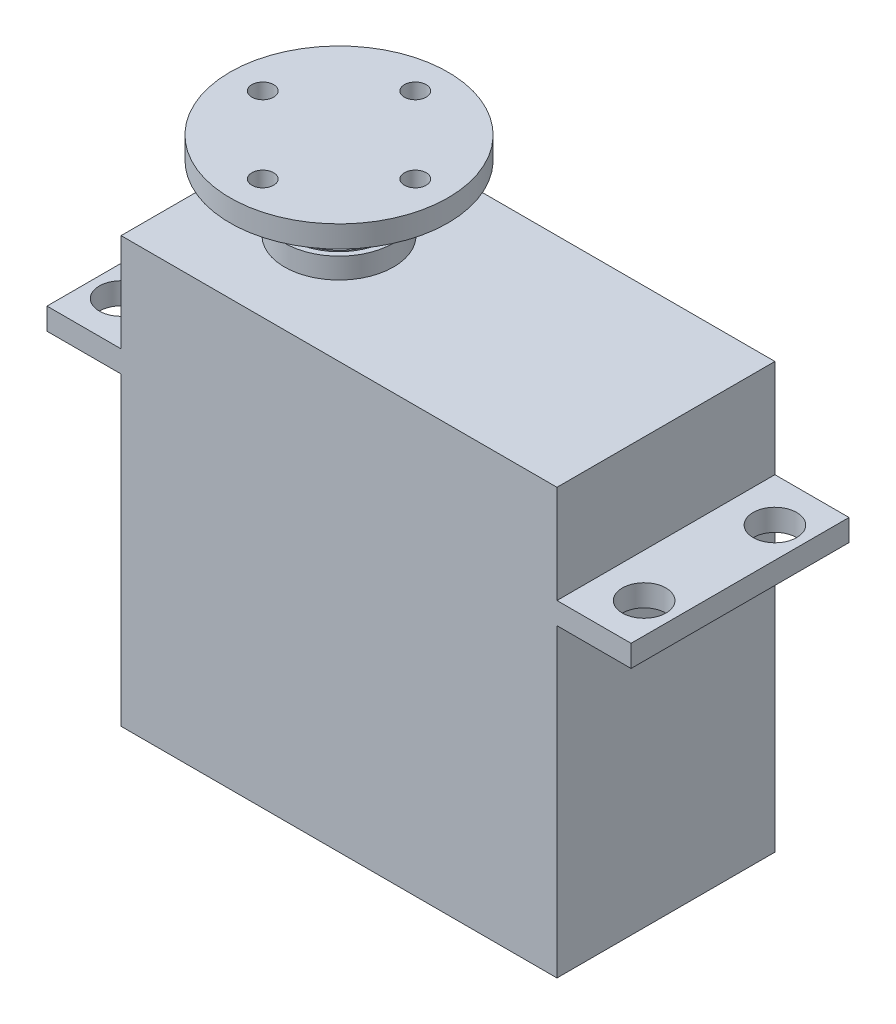
ISO-10303-21;
HEADER;
FILE_DESCRIPTION(('STEP AP214'),'2;1');
FILE_NAME('part.step','',(''),(''),'','','');
FILE_SCHEMA(('AUTOMOTIVE_DESIGN { 1 0 10303 214 1 1 1 1 }'));
ENDSEC;
DATA;
#1=APPLICATION_CONTEXT('core data for automotive mechanical design processes');
#2=APPLICATION_PROTOCOL_DEFINITION('international standard','automotive_design',2000,#1);
#3=PRODUCT_CONTEXT('',#1,'mechanical');
#4=PRODUCT('Part','Part','',(#3));
#5=PRODUCT_RELATED_PRODUCT_CATEGORY('part','',(#4));
#6=PRODUCT_DEFINITION_FORMATION('','',#4);
#7=PRODUCT_DEFINITION_CONTEXT('part definition',#1,'design');
#8=PRODUCT_DEFINITION('design','',#6,#7);
#9=PRODUCT_DEFINITION_SHAPE('','',#8);
#10=(LENGTH_UNIT() NAMED_UNIT(*) SI_UNIT(.MILLI.,.METRE.));
#11=(NAMED_UNIT(*) PLANE_ANGLE_UNIT() SI_UNIT($,.RADIAN.));
#12=(NAMED_UNIT(*) SI_UNIT($,.STERADIAN.) SOLID_ANGLE_UNIT());
#13=UNCERTAINTY_MEASURE_WITH_UNIT(LENGTH_MEASURE(1.E-05),#10,'distance_accuracy_value','');
#14=(GEOMETRIC_REPRESENTATION_CONTEXT(3) GLOBAL_UNCERTAINTY_ASSIGNED_CONTEXT((#13)) GLOBAL_UNIT_ASSIGNED_CONTEXT((#10,
#11,#12)) REPRESENTATION_CONTEXT('',''));
#15=CARTESIAN_POINT('',(0.,0.,0.));
#16=DIRECTION('',(0.,0.,1.));
#17=DIRECTION('',(1.,0.,0.));
#18=AXIS2_PLACEMENT_3D('',#15,#16,#17);
#19=CARTESIAN_POINT('',(0.,6.72298684190975,20.));
#20=DIRECTION('',(0.,-1.,0.));
#21=DIRECTION('',(1.,0.,0.));
#22=AXIS2_PLACEMENT_3D('',#19,#20,#21);
#23=PLANE('',#22);
#24=CARTESIAN_POINT('',(-24.,6.72298684190976,4.));
#25=DIRECTION('',(0.,-1.,0.));
#26=DIRECTION('',(1.,0.,0.));
#27=AXIS2_PLACEMENT_3D('',#24,#25,#26);
#28=CIRCLE('',#27,2.);
#29=CARTESIAN_POINT('',(-22.,6.72298684190976,4.));
#30=VERTEX_POINT('',#29);
#31=EDGE_CURVE('E284',#30,#30,#28,.T.);
#32=ORIENTED_EDGE('',*,*,#31,.F.);
#33=EDGE_LOOP('',(#32));
#34=FACE_BOUND('',#33,.T.);
#35=CARTESIAN_POINT('',(-24.,6.72298684190976,16.));
#36=DIRECTION('',(0.,-1.,0.));
#37=DIRECTION('',(1.,0.,0.));
#38=AXIS2_PLACEMENT_3D('',#35,#36,#37);
#39=CIRCLE('',#38,2.);
#40=CARTESIAN_POINT('',(-22.,6.72298684190976,16.));
#41=VERTEX_POINT('',#40);
#42=EDGE_CURVE('E277',#41,#41,#39,.T.);
#43=ORIENTED_EDGE('',*,*,#42,.F.);
#44=EDGE_LOOP('',(#43));
#45=FACE_BOUND('',#44,.T.);
#46=DIRECTION('',(-1.,0.,0.));
#47=VECTOR('',#46,1.);
#48=CARTESIAN_POINT('',(0.,6.72298684190975,0.));
#49=LINE('',#48,#47);
#50=CARTESIAN_POINT('',(-20.,6.72298684190976,0.));
#51=VERTEX_POINT('',#50);
#52=CARTESIAN_POINT('',(-26.8,6.72298684190976,0.));
#53=VERTEX_POINT('',#52);
#54=EDGE_CURVE('E177',#51,#53,#49,.T.);
#55=ORIENTED_EDGE('',*,*,#54,.F.);
#56=DIRECTION('',(0.,0.,-1.));
#57=VECTOR('',#56,1.);
#58=CARTESIAN_POINT('',(-20.,6.72298684190976,20.));
#59=LINE('',#58,#57);
#60=CARTESIAN_POINT('',(-20.,6.72298684190976,20.));
#61=VERTEX_POINT('',#60);
#62=EDGE_CURVE('E60',#61,#51,#59,.T.);
#63=ORIENTED_EDGE('',*,*,#62,.F.);
#64=DIRECTION('',(-1.,0.,0.));
#65=VECTOR('',#64,1.);
#66=CARTESIAN_POINT('',(0.,6.72298684190975,20.));
#67=LINE('',#66,#65);
#68=CARTESIAN_POINT('',(-26.8,6.72298684190976,20.));
#69=VERTEX_POINT('',#68);
#70=EDGE_CURVE('E215',#61,#69,#67,.T.);
#71=ORIENTED_EDGE('',*,*,#70,.T.);
#72=DIRECTION('',(0.,0.,-1.));
#73=VECTOR('',#72,1.);
#74=CARTESIAN_POINT('',(-26.8,6.72298684190976,20.));
#75=LINE('',#74,#73);
#76=EDGE_CURVE('E117',#69,#53,#75,.T.);
#77=ORIENTED_EDGE('',*,*,#76,.T.);
#78=EDGE_LOOP('',(#55,#63,#71,#77));
#79=FACE_BOUND('',#78,.T.);
#80=ADVANCED_FACE('F50',(#34,#45,#79),#23,.T.);
#81=CARTESIAN_POINT('',(-20.,0.,20.));
#82=DIRECTION('',(1.,0.,0.));
#83=DIRECTION('',(0.,1.,0.));
#84=AXIS2_PLACEMENT_3D('',#81,#82,#83);
#85=PLANE('',#84);
#86=DIRECTION('',(0.,-1.,0.));
#87=VECTOR('',#86,1.);
#88=CARTESIAN_POINT('',(-20.,0.,0.));
#89=LINE('',#88,#87);
#90=CARTESIAN_POINT('',(-20.,-21.2770131580902,0.));
#91=VERTEX_POINT('',#90);
#92=EDGE_CURVE('E181',#51,#91,#89,.T.);
#93=ORIENTED_EDGE('',*,*,#92,.T.);
#94=DIRECTION('',(0.,0.,-1.));
#95=VECTOR('',#94,1.);
#96=CARTESIAN_POINT('',(-20.,-21.2770131580902,20.));
#97=LINE('',#96,#95);
#98=CARTESIAN_POINT('',(-20.,-21.2770131580902,20.));
#99=VERTEX_POINT('',#98);
#100=EDGE_CURVE('E240',#99,#91,#97,.T.);
#101=ORIENTED_EDGE('',*,*,#100,.F.);
#102=DIRECTION('',(0.,-1.,0.));
#103=VECTOR('',#102,1.);
#104=CARTESIAN_POINT('',(-20.,0.,20.));
#105=LINE('',#104,#103);
#106=EDGE_CURVE('E160',#61,#99,#105,.T.);
#107=ORIENTED_EDGE('',*,*,#106,.F.);
#108=ORIENTED_EDGE('',*,*,#62,.T.);
#109=EDGE_LOOP('',(#93,#101,#107,#108));
#110=FACE_BOUND('',#109,.T.);
#111=ADVANCED_FACE('F386',(#110),#85,.F.);
#112=CARTESIAN_POINT('',(0.,-21.2770131580902,20.));
#113=DIRECTION('',(0.,1.,0.));
#114=DIRECTION('',(0.,0.,1.));
#115=AXIS2_PLACEMENT_3D('',#112,#113,#114);
#116=PLANE('',#115);
#117=DIRECTION('',(1.,0.,0.));
#118=VECTOR('',#117,1.);
#119=CARTESIAN_POINT('',(0.,-21.2770131580902,0.));
#120=LINE('',#119,#118);
#121=CARTESIAN_POINT('',(20.,-21.2770131580902,0.));
#122=VERTEX_POINT('',#121);
#123=EDGE_CURVE('E185',#91,#122,#120,.T.);
#124=ORIENTED_EDGE('',*,*,#123,.T.);
#125=DIRECTION('',(0.,0.,-1.));
#126=VECTOR('',#125,1.);
#127=CARTESIAN_POINT('',(20.,-21.2770131580902,20.));
#128=LINE('',#127,#126);
#129=CARTESIAN_POINT('',(20.,-21.2770131580902,20.));
#130=VERTEX_POINT('',#129);
#131=EDGE_CURVE('E237',#130,#122,#128,.T.);
#132=ORIENTED_EDGE('',*,*,#131,.F.);
#133=DIRECTION('',(1.,0.,0.));
#134=VECTOR('',#133,1.);
#135=CARTESIAN_POINT('',(0.,-21.2770131580902,20.));
#136=LINE('',#135,#134);
#137=EDGE_CURVE('E329',#99,#130,#136,.T.);
#138=ORIENTED_EDGE('',*,*,#137,.F.);
#139=ORIENTED_EDGE('',*,*,#100,.T.);
#140=EDGE_LOOP('',(#124,#132,#138,#139));
#141=FACE_BOUND('',#140,.T.);
#142=ADVANCED_FACE('F381',(#141),#116,.F.);
#143=CARTESIAN_POINT('',(20.,0.,20.));
#144=DIRECTION('',(1.,0.,0.));
#145=DIRECTION('',(0.,1.,0.));
#146=AXIS2_PLACEMENT_3D('',#143,#144,#145);
#147=PLANE('',#146);
#148=DIRECTION('',(0.,-1.,0.));
#149=VECTOR('',#148,1.);
#150=CARTESIAN_POINT('',(20.,0.,0.));
#151=LINE('',#150,#149);
#152=CARTESIAN_POINT('',(20.,6.72298684190976,0.));
#153=VERTEX_POINT('',#152);
#154=EDGE_CURVE('E189',#153,#122,#151,.T.);
#155=ORIENTED_EDGE('',*,*,#154,.F.);
#156=DIRECTION('',(0.,0.,-1.));
#157=VECTOR('',#156,1.);
#158=CARTESIAN_POINT('',(20.,6.72298684190976,20.));
#159=LINE('',#158,#157);
#160=CARTESIAN_POINT('',(20.,6.72298684190976,20.));
#161=VERTEX_POINT('',#160);
#162=EDGE_CURVE('E234',#161,#153,#159,.T.);
#163=ORIENTED_EDGE('',*,*,#162,.F.);
#164=DIRECTION('',(0.,-1.,0.));
#165=VECTOR('',#164,1.);
#166=CARTESIAN_POINT('',(20.,0.,20.));
#167=LINE('',#166,#165);
#168=EDGE_CURVE('E332',#161,#130,#167,.T.);
#169=ORIENTED_EDGE('',*,*,#168,.T.);
#170=ORIENTED_EDGE('',*,*,#131,.T.);
#171=EDGE_LOOP('',(#155,#163,#169,#170));
#172=FACE_BOUND('',#171,.T.);
#173=ADVANCED_FACE('F375',(#172),#147,.T.);
#174=CARTESIAN_POINT('',(0.,6.72298684190975,20.));
#175=DIRECTION('',(0.,1.,0.));
#176=DIRECTION('',(-1.,0.,0.));
#177=AXIS2_PLACEMENT_3D('',#174,#175,#176);
#178=PLANE('',#177);
#179=CARTESIAN_POINT('',(24.,6.72298684190976,4.));
#180=DIRECTION('',(0.,1.,0.));
#181=DIRECTION('',(-1.,0.,0.));
#182=AXIS2_PLACEMENT_3D('',#179,#180,#181);
#183=CIRCLE('',#182,2.);
#184=CARTESIAN_POINT('',(22.,6.72298684190976,4.));
#185=VERTEX_POINT('',#184);
#186=EDGE_CURVE('E300',#185,#185,#183,.T.);
#187=ORIENTED_EDGE('',*,*,#186,.T.);
#188=EDGE_LOOP('',(#187));
#189=FACE_BOUND('',#188,.T.);
#190=CARTESIAN_POINT('',(24.,6.72298684190976,16.));
#191=DIRECTION('',(0.,1.,0.));
#192=DIRECTION('',(-1.,0.,0.));
#193=AXIS2_PLACEMENT_3D('',#190,#191,#192);
#194=CIRCLE('',#193,2.);
#195=CARTESIAN_POINT('',(22.,6.72298684190976,16.));
#196=VERTEX_POINT('',#195);
#197=EDGE_CURVE('E293',#196,#196,#194,.T.);
#198=ORIENTED_EDGE('',*,*,#197,.T.);
#199=EDGE_LOOP('',(#198));
#200=FACE_BOUND('',#199,.T.);
#201=DIRECTION('',(1.,0.,0.));
#202=VECTOR('',#201,1.);
#203=CARTESIAN_POINT('',(0.,6.72298684190975,0.));
#204=LINE('',#203,#202);
#205=CARTESIAN_POINT('',(26.8,6.72298684190976,0.));
#206=VERTEX_POINT('',#205);
#207=EDGE_CURVE('E193',#153,#206,#204,.T.);
#208=ORIENTED_EDGE('',*,*,#207,.T.);
#209=DIRECTION('',(0.,0.,-1.));
#210=VECTOR('',#209,1.);
#211=CARTESIAN_POINT('',(26.8,6.72298684190976,20.));
#212=LINE('',#211,#210);
#213=CARTESIAN_POINT('',(26.8,6.72298684190976,20.));
#214=VERTEX_POINT('',#213);
#215=EDGE_CURVE('E231',#214,#206,#212,.T.);
#216=ORIENTED_EDGE('',*,*,#215,.F.);
#217=DIRECTION('',(1.,0.,0.));
#218=VECTOR('',#217,1.);
#219=CARTESIAN_POINT('',(0.,6.72298684190975,20.));
#220=LINE('',#219,#218);
#221=EDGE_CURVE('E336',#161,#214,#220,.T.);
#222=ORIENTED_EDGE('',*,*,#221,.F.);
#223=ORIENTED_EDGE('',*,*,#162,.T.);
#224=EDGE_LOOP('',(#208,#216,#222,#223));
#225=FACE_BOUND('',#224,.T.);
#226=ADVANCED_FACE('F469',(#189,#200,#225),#178,.F.);
#227=CARTESIAN_POINT('',(26.8,0.,20.));
#228=DIRECTION('',(1.,0.,0.));
#229=DIRECTION('',(0.,0.,-1.));
#230=AXIS2_PLACEMENT_3D('',#227,#228,#229);
#231=PLANE('',#230);
#232=DIRECTION('',(0.,-1.,0.));
#233=VECTOR('',#232,1.);
#234=CARTESIAN_POINT('',(26.8,0.,0.));
#235=LINE('',#234,#233);
#236=CARTESIAN_POINT('',(26.8,8.72298684190976,0.));
#237=VERTEX_POINT('',#236);
#238=EDGE_CURVE('E198',#237,#206,#235,.T.);
#239=ORIENTED_EDGE('',*,*,#238,.F.);
#240=DIRECTION('',(0.,0.,-1.));
#241=VECTOR('',#240,1.);
#242=CARTESIAN_POINT('',(26.8,8.72298684190976,20.));
#243=LINE('',#242,#241);
#244=CARTESIAN_POINT('',(26.8,8.72298684190976,20.));
#245=VERTEX_POINT('',#244);
#246=EDGE_CURVE('E228',#245,#237,#243,.T.);
#247=ORIENTED_EDGE('',*,*,#246,.F.);
#248=DIRECTION('',(0.,-1.,0.));
#249=VECTOR('',#248,1.);
#250=CARTESIAN_POINT('',(26.8,0.,20.));
#251=LINE('',#250,#249);
#252=EDGE_CURVE('E340',#245,#214,#251,.T.);
#253=ORIENTED_EDGE('',*,*,#252,.T.);
#254=ORIENTED_EDGE('',*,*,#215,.T.);
#255=EDGE_LOOP('',(#239,#247,#253,#254));
#256=FACE_BOUND('',#255,.T.);
#257=ADVANCED_FACE('F368',(#256),#231,.T.);
#258=CARTESIAN_POINT('',(0.,8.72298684190976,20.));
#259=DIRECTION('',(0.,1.,0.));
#260=DIRECTION('',(-1.,0.,0.));
#261=AXIS2_PLACEMENT_3D('',#258,#259,#260);
#262=PLANE('',#261);
#263=CARTESIAN_POINT('',(24.,8.72298684190976,4.));
#264=DIRECTION('',(0.,1.,0.));
#265=DIRECTION('',(-1.,0.,0.));
#266=AXIS2_PLACEMENT_3D('',#263,#264,#265);
#267=CIRCLE('',#266,2.);
#268=CARTESIAN_POINT('',(22.,8.72298684190976,4.));
#269=VERTEX_POINT('',#268);
#270=EDGE_CURVE('E289',#269,#269,#267,.T.);
#271=ORIENTED_EDGE('',*,*,#270,.F.);
#272=EDGE_LOOP('',(#271));
#273=FACE_BOUND('',#272,.T.);
#274=CARTESIAN_POINT('',(24.,8.72298684190976,16.));
#275=DIRECTION('',(0.,1.,0.));
#276=DIRECTION('',(-1.,0.,0.));
#277=AXIS2_PLACEMENT_3D('',#274,#275,#276);
#278=CIRCLE('',#277,2.);
#279=CARTESIAN_POINT('',(22.,8.72298684190976,16.));
#280=VERTEX_POINT('',#279);
#281=EDGE_CURVE('E288',#280,#280,#278,.T.);
#282=ORIENTED_EDGE('',*,*,#281,.F.);
#283=EDGE_LOOP('',(#282));
#284=FACE_BOUND('',#283,.T.);
#285=DIRECTION('',(1.,0.,0.));
#286=VECTOR('',#285,1.);
#287=CARTESIAN_POINT('',(0.,8.72298684190976,0.));
#288=LINE('',#287,#286);
#289=CARTESIAN_POINT('',(20.,8.72298684190976,0.));
#290=VERTEX_POINT('',#289);
#291=EDGE_CURVE('E202',#290,#237,#288,.T.);
#292=ORIENTED_EDGE('',*,*,#291,.F.);
#293=DIRECTION('',(0.,0.,-1.));
#294=VECTOR('',#293,1.);
#295=CARTESIAN_POINT('',(20.,8.72298684190976,20.));
#296=LINE('',#295,#294);
#297=CARTESIAN_POINT('',(20.,8.72298684190976,20.));
#298=VERTEX_POINT('',#297);
#299=EDGE_CURVE('E225',#298,#290,#296,.T.);
#300=ORIENTED_EDGE('',*,*,#299,.F.);
#301=DIRECTION('',(1.,0.,0.));
#302=VECTOR('',#301,1.);
#303=CARTESIAN_POINT('',(0.,8.72298684190976,20.));
#304=LINE('',#303,#302);
#305=EDGE_CURVE('E343',#298,#245,#304,.T.);
#306=ORIENTED_EDGE('',*,*,#305,.T.);
#307=ORIENTED_EDGE('',*,*,#246,.T.);
#308=EDGE_LOOP('',(#292,#300,#306,#307));
#309=FACE_BOUND('',#308,.T.);
#310=ADVANCED_FACE('F364',(#273,#284,#309),#262,.T.);
#311=CARTESIAN_POINT('',(20.,17.7229868419098,0.));
#312=VERTEX_POINT('',#311);
#313=EDGE_CURVE('E194',#312,#290,#151,.T.);
#314=ORIENTED_EDGE('',*,*,#313,.F.);
#315=DIRECTION('',(0.,0.,-1.));
#316=VECTOR('',#315,1.);
#317=CARTESIAN_POINT('',(20.,17.7229868419098,20.));
#318=LINE('',#317,#316);
#319=CARTESIAN_POINT('',(20.,17.7229868419098,20.));
#320=VERTEX_POINT('',#319);
#321=EDGE_CURVE('E222',#320,#312,#318,.T.);
#322=ORIENTED_EDGE('',*,*,#321,.F.);
#323=EDGE_CURVE('E337',#320,#298,#167,.T.);
#324=ORIENTED_EDGE('',*,*,#323,.T.);
#325=ORIENTED_EDGE('',*,*,#299,.T.);
#326=EDGE_LOOP('',(#314,#322,#324,#325));
#327=FACE_BOUND('',#326,.T.);
#328=ADVANCED_FACE('F363',(#327),#147,.T.);
#329=CARTESIAN_POINT('',(0.,17.7229868419098,20.));
#330=DIRECTION('',(0.,1.,0.));
#331=DIRECTION('',(-1.,0.,0.));
#332=AXIS2_PLACEMENT_3D('',#329,#330,#331);
#333=PLANE('',#332);
#334=CARTESIAN_POINT('',(-10.,17.7229868419098,10.));
#335=DIRECTION('',(0.,1.,0.));
#336=DIRECTION('',(-1.,0.,0.));
#337=AXIS2_PLACEMENT_3D('',#334,#335,#336);
#338=CIRCLE('',#337,5.);
#339=CARTESIAN_POINT('',(-5.,17.7229868419098,10.));
#340=VERTEX_POINT('',#339);
#341=EDGE_CURVE('E315',#340,#340,#338,.T.);
#342=ORIENTED_EDGE('',*,*,#341,.F.);
#343=EDGE_LOOP('',(#342));
#344=FACE_BOUND('',#343,.T.);
#345=DIRECTION('',(1.,0.,0.));
#346=VECTOR('',#345,1.);
#347=CARTESIAN_POINT('',(0.,17.7229868419098,0.));
#348=LINE('',#347,#346);
#349=CARTESIAN_POINT('',(-20.,17.7229868419098,0.));
#350=VERTEX_POINT('',#349);
#351=EDGE_CURVE('E206',#350,#312,#348,.T.);
#352=ORIENTED_EDGE('',*,*,#351,.F.);
#353=DIRECTION('',(0.,0.,-1.));
#354=VECTOR('',#353,1.);
#355=CARTESIAN_POINT('',(-20.,17.7229868419098,20.));
#356=LINE('',#355,#354);
#357=CARTESIAN_POINT('',(-20.,17.7229868419098,20.));
#358=VERTEX_POINT('',#357);
#359=EDGE_CURVE('E166',#358,#350,#356,.T.);
#360=ORIENTED_EDGE('',*,*,#359,.F.);
#361=DIRECTION('',(1.,0.,0.));
#362=VECTOR('',#361,1.);
#363=CARTESIAN_POINT('',(0.,17.7229868419098,20.));
#364=LINE('',#363,#362);
#365=EDGE_CURVE('E156',#358,#320,#364,.T.);
#366=ORIENTED_EDGE('',*,*,#365,.T.);
#367=ORIENTED_EDGE('',*,*,#321,.T.);
#368=EDGE_LOOP('',(#352,#360,#366,#367));
#369=FACE_BOUND('',#368,.T.);
#370=ADVANCED_FACE('F354',(#344,#369),#333,.T.);
#371=CARTESIAN_POINT('',(-20.,8.72298684190976,0.));
#372=VERTEX_POINT('',#371);
#373=EDGE_CURVE('E164',#350,#372,#89,.T.);
#374=ORIENTED_EDGE('',*,*,#373,.T.);
#375=DIRECTION('',(0.,0.,-1.));
#376=VECTOR('',#375,1.);
#377=CARTESIAN_POINT('',(-20.,8.72298684190976,20.));
#378=LINE('',#377,#376);
#379=CARTESIAN_POINT('',(-20.,8.72298684190976,20.));
#380=VERTEX_POINT('',#379);
#381=EDGE_CURVE('E161',#380,#372,#378,.T.);
#382=ORIENTED_EDGE('',*,*,#381,.F.);
#383=EDGE_CURVE('E149',#358,#380,#105,.T.);
#384=ORIENTED_EDGE('',*,*,#383,.F.);
#385=ORIENTED_EDGE('',*,*,#359,.T.);
#386=EDGE_LOOP('',(#374,#382,#384,#385));
#387=FACE_BOUND('',#386,.T.);
#388=ADVANCED_FACE('F162',(#387),#85,.F.);
#389=CARTESIAN_POINT('',(0.,8.72298684190976,20.));
#390=DIRECTION('',(0.,-1.,0.));
#391=DIRECTION('',(1.,0.,0.));
#392=AXIS2_PLACEMENT_3D('',#389,#390,#391);
#393=PLANE('',#392);
#394=CARTESIAN_POINT('',(-24.,8.72298684190977,4.));
#395=DIRECTION('',(0.,1.,0.));
#396=DIRECTION('',(-1.,0.,0.));
#397=AXIS2_PLACEMENT_3D('',#394,#395,#396);
#398=CIRCLE('',#397,2.);
#399=CARTESIAN_POINT('',(-26.,8.72298684190977,4.));
#400=VERTEX_POINT('',#399);
#401=EDGE_CURVE('E271',#400,#400,#398,.T.);
#402=ORIENTED_EDGE('',*,*,#401,.F.);
#403=EDGE_LOOP('',(#402));
#404=FACE_BOUND('',#403,.T.);
#405=CARTESIAN_POINT('',(-24.,8.72298684190977,16.));
#406=DIRECTION('',(0.,1.,0.));
#407=DIRECTION('',(-1.,0.,0.));
#408=AXIS2_PLACEMENT_3D('',#405,#406,#407);
#409=CIRCLE('',#408,2.);
#410=CARTESIAN_POINT('',(-26.,8.72298684190977,16.));
#411=VERTEX_POINT('',#410);
#412=EDGE_CURVE('E266',#411,#411,#409,.T.);
#413=ORIENTED_EDGE('',*,*,#412,.F.);
#414=EDGE_LOOP('',(#413));
#415=FACE_BOUND('',#414,.T.);
#416=DIRECTION('',(-1.,0.,0.));
#417=VECTOR('',#416,1.);
#418=CARTESIAN_POINT('',(0.,8.72298684190976,0.));
#419=LINE('',#418,#417);
#420=CARTESIAN_POINT('',(-26.8,8.72298684190976,0.));
#421=VERTEX_POINT('',#420);
#422=EDGE_CURVE('E110',#372,#421,#419,.T.);
#423=ORIENTED_EDGE('',*,*,#422,.T.);
#424=DIRECTION('',(0.,0.,-1.));
#425=VECTOR('',#424,1.);
#426=CARTESIAN_POINT('',(-26.8,8.72298684190976,20.));
#427=LINE('',#426,#425);
#428=CARTESIAN_POINT('',(-26.8,8.72298684190976,20.));
#429=VERTEX_POINT('',#428);
#430=EDGE_CURVE('E167',#429,#421,#427,.T.);
#431=ORIENTED_EDGE('',*,*,#430,.F.);
#432=DIRECTION('',(-1.,0.,0.));
#433=VECTOR('',#432,1.);
#434=CARTESIAN_POINT('',(0.,8.72298684190976,20.));
#435=LINE('',#434,#433);
#436=EDGE_CURVE('E153',#380,#429,#435,.T.);
#437=ORIENTED_EDGE('',*,*,#436,.F.);
#438=ORIENTED_EDGE('',*,*,#381,.T.);
#439=EDGE_LOOP('',(#423,#431,#437,#438));
#440=FACE_BOUND('',#439,.T.);
#441=ADVANCED_FACE('F169',(#404,#415,#440),#393,.F.);
#442=CARTESIAN_POINT('',(-26.8,0.,20.));
#443=DIRECTION('',(1.,0.,0.));
#444=DIRECTION('',(0.,0.,-1.));
#445=AXIS2_PLACEMENT_3D('',#442,#443,#444);
#446=PLANE('',#445);
#447=DIRECTION('',(0.,-1.,0.));
#448=VECTOR('',#447,1.);
#449=CARTESIAN_POINT('',(-26.8,0.,0.));
#450=LINE('',#449,#448);
#451=EDGE_CURVE('E212',#421,#53,#450,.T.);
#452=ORIENTED_EDGE('',*,*,#451,.T.);
#453=ORIENTED_EDGE('',*,*,#76,.F.);
#454=DIRECTION('',(0.,-1.,0.));
#455=VECTOR('',#454,1.);
#456=CARTESIAN_POINT('',(-26.8,0.,20.));
#457=LINE('',#456,#455);
#458=EDGE_CURVE('E69',#429,#69,#457,.T.);
#459=ORIENTED_EDGE('',*,*,#458,.F.);
#460=ORIENTED_EDGE('',*,*,#430,.T.);
#461=EDGE_LOOP('',(#452,#453,#459,#460));
#462=FACE_BOUND('',#461,.T.);
#463=ADVANCED_FACE('F449',(#462),#446,.F.);
#464=CARTESIAN_POINT('',(0.,0.,20.));
#465=DIRECTION('',(0.,0.,1.));
#466=DIRECTION('',(1.,0.,0.));
#467=AXIS2_PLACEMENT_3D('',#464,#465,#466);
#468=PLANE('',#467);
#469=ORIENTED_EDGE('',*,*,#70,.F.);
#470=ORIENTED_EDGE('',*,*,#106,.T.);
#471=ORIENTED_EDGE('',*,*,#137,.T.);
#472=ORIENTED_EDGE('',*,*,#168,.F.);
#473=ORIENTED_EDGE('',*,*,#221,.T.);
#474=ORIENTED_EDGE('',*,*,#252,.F.);
#475=ORIENTED_EDGE('',*,*,#305,.F.);
#476=ORIENTED_EDGE('',*,*,#323,.F.);
#477=ORIENTED_EDGE('',*,*,#365,.F.);
#478=ORIENTED_EDGE('',*,*,#383,.T.);
#479=ORIENTED_EDGE('',*,*,#436,.T.);
#480=ORIENTED_EDGE('',*,*,#458,.T.);
#481=EDGE_LOOP('',(#469,#470,#471,#472,#473,#474,#475,#476,#477,#478,#479,#480));
#482=FACE_BOUND('',#481,.T.);
#483=ADVANCED_FACE('F151',(#482),#468,.T.);
#484=CARTESIAN_POINT('',(0.,0.,0.));
#485=DIRECTION('',(0.,0.,1.));
#486=DIRECTION('',(1.,0.,0.));
#487=AXIS2_PLACEMENT_3D('',#484,#485,#486);
#488=PLANE('',#487);
#489=ORIENTED_EDGE('',*,*,#54,.T.);
#490=ORIENTED_EDGE('',*,*,#451,.F.);
#491=ORIENTED_EDGE('',*,*,#422,.F.);
#492=ORIENTED_EDGE('',*,*,#373,.F.);
#493=ORIENTED_EDGE('',*,*,#351,.T.);
#494=ORIENTED_EDGE('',*,*,#313,.T.);
#495=ORIENTED_EDGE('',*,*,#291,.T.);
#496=ORIENTED_EDGE('',*,*,#238,.T.);
#497=ORIENTED_EDGE('',*,*,#207,.F.);
#498=ORIENTED_EDGE('',*,*,#154,.T.);
#499=ORIENTED_EDGE('',*,*,#123,.F.);
#500=ORIENTED_EDGE('',*,*,#92,.F.);
#501=EDGE_LOOP('',(#489,#490,#491,#492,#493,#494,#495,#496,#497,#498,#499,#500));
#502=FACE_BOUND('',#501,.T.);
#503=ADVANCED_FACE('F357',(#502),#488,.F.);
#504=CARTESIAN_POINT('',(-10.,19.6229868419098,10.));
#505=DIRECTION('',(0.,-1.,0.));
#506=DIRECTION('',(1.,0.,0.));
#507=AXIS2_PLACEMENT_3D('',#504,#505,#506);
#508=CYLINDRICAL_SURFACE('',#507,5.);
#509=CARTESIAN_POINT('',(-10.,19.6229868419098,10.));
#510=DIRECTION('',(0.,1.,0.));
#511=DIRECTION('',(-1.,0.,0.));
#512=AXIS2_PLACEMENT_3D('',#509,#510,#511);
#513=CIRCLE('',#512,5.);
#514=CARTESIAN_POINT('',(-5.,19.6229868419098,10.));
#515=VERTEX_POINT('',#514);
#516=EDGE_CURVE('E250',#515,#515,#513,.T.);
#517=CARTESIAN_POINT('',(-5.,19.6229868419098,10.));
#518=CARTESIAN_POINT('',(-5.,19.6031951752431,10.));
#519=CARTESIAN_POINT('',(-5.,19.5834035085764,10.));
#520=CARTESIAN_POINT('',(-5.,19.5438201752431,10.));
#521=CARTESIAN_POINT('',(-5.,19.5240285085764,10.));
#522=CARTESIAN_POINT('',(-5.,19.4844451752431,10.));
#523=CARTESIAN_POINT('',(-5.,19.4646535085764,10.));
#524=CARTESIAN_POINT('',(-5.,19.4250701752431,10.));
#525=CARTESIAN_POINT('',(-5.,19.4052785085764,10.));
#526=CARTESIAN_POINT('',(-5.,19.3656951752431,10.));
#527=CARTESIAN_POINT('',(-5.,19.3459035085764,10.));
#528=CARTESIAN_POINT('',(-5.,19.3063201752431,10.));
#529=CARTESIAN_POINT('',(-5.,19.2865285085764,10.));
#530=CARTESIAN_POINT('',(-5.,19.2469451752431,10.));
#531=CARTESIAN_POINT('',(-5.,19.2271535085764,10.));
#532=CARTESIAN_POINT('',(-5.,19.1875701752431,10.));
#533=CARTESIAN_POINT('',(-5.,19.1677785085764,10.));
#534=CARTESIAN_POINT('',(-5.,19.1281951752431,10.));
#535=CARTESIAN_POINT('',(-5.,19.1084035085764,10.));
#536=CARTESIAN_POINT('',(-5.,19.0688201752431,10.));
#537=CARTESIAN_POINT('',(-5.,19.0490285085764,10.));
#538=CARTESIAN_POINT('',(-5.,19.0094451752431,10.));
#539=CARTESIAN_POINT('',(-5.,18.9896535085764,10.));
#540=CARTESIAN_POINT('',(-5.,18.9500701752431,10.));
#541=CARTESIAN_POINT('',(-5.,18.9302785085764,10.));
#542=CARTESIAN_POINT('',(-5.,18.8906951752431,10.));
#543=CARTESIAN_POINT('',(-5.,18.8709035085764,10.));
#544=CARTESIAN_POINT('',(-5.,18.8313201752431,10.));
#545=CARTESIAN_POINT('',(-5.,18.8115285085764,10.));
#546=CARTESIAN_POINT('',(-5.,18.7719451752431,10.));
#547=CARTESIAN_POINT('',(-5.,18.7521535085764,10.));
#548=CARTESIAN_POINT('',(-5.,18.7125701752431,10.));
#549=CARTESIAN_POINT('',(-5.,18.6927785085764,10.));
#550=CARTESIAN_POINT('',(-5.,18.6531951752431,10.));
#551=CARTESIAN_POINT('',(-5.,18.6334035085764,10.));
#552=CARTESIAN_POINT('',(-5.,18.5938201752431,10.));
#553=CARTESIAN_POINT('',(-5.,18.5740285085764,10.));
#554=CARTESIAN_POINT('',(-5.,18.5344451752431,10.));
#555=CARTESIAN_POINT('',(-5.,18.5146535085764,10.));
#556=CARTESIAN_POINT('',(-5.,18.4750701752431,10.));
#557=CARTESIAN_POINT('',(-5.,18.4552785085764,10.));
#558=CARTESIAN_POINT('',(-5.,18.4156951752431,10.));
#559=CARTESIAN_POINT('',(-5.,18.3959035085764,10.));
#560=CARTESIAN_POINT('',(-5.,18.3563201752431,10.));
#561=CARTESIAN_POINT('',(-5.,18.3365285085764,10.));
#562=CARTESIAN_POINT('',(-5.,18.2969451752431,10.));
#563=CARTESIAN_POINT('',(-5.,18.2771535085764,10.));
#564=CARTESIAN_POINT('',(-5.,18.2375701752431,10.));
#565=CARTESIAN_POINT('',(-5.,18.2177785085764,10.));
#566=CARTESIAN_POINT('',(-5.,18.1781951752431,10.));
#567=CARTESIAN_POINT('',(-5.,18.1584035085764,10.));
#568=CARTESIAN_POINT('',(-5.,18.1188201752431,10.));
#569=CARTESIAN_POINT('',(-5.,18.0990285085764,10.));
#570=CARTESIAN_POINT('',(-5.,18.0594451752431,10.));
#571=CARTESIAN_POINT('',(-5.,18.0396535085764,10.));
#572=CARTESIAN_POINT('',(-5.,18.0000701752431,10.));
#573=CARTESIAN_POINT('',(-5.,17.9802785085764,10.));
#574=CARTESIAN_POINT('',(-5.,17.9406951752431,10.));
#575=CARTESIAN_POINT('',(-5.,17.9209035085764,10.));
#576=CARTESIAN_POINT('',(-5.,17.8813201752431,10.));
#577=CARTESIAN_POINT('',(-5.,17.8615285085764,10.));
#578=CARTESIAN_POINT('',(-5.,17.8219451752431,10.));
#579=CARTESIAN_POINT('',(-5.,17.8021535085764,10.));
#580=CARTESIAN_POINT('',(-5.,17.7625701752431,10.));
#581=CARTESIAN_POINT('',(-5.,17.7427785085764,10.));
#582=CARTESIAN_POINT('',(-5.,17.7229868419098,10.));
#583=B_SPLINE_CURVE_WITH_KNOTS('',3,(#517,#518,#519,#520,#521,#522,#523,#524,#525,#526,#527,
#528,#529,#530,#531,#532,#533,#534,#535,#536,#537,#538,#539,#540,#541,#542,#543,#544,#545,#546,
#547,#548,#549,#550,#551,#552,#553,#554,#555,#556,#557,#558,#559,#560,#561,#562,#563,#564,#565,
#566,#567,#568,#569,#570,#571,#572,#573,#574,#575,#576,#577,#578,#579,#580,#581,#582),
.UNSPECIFIED.,.F.,.F.,(4,2,2,2,2,2,2,2,2,2,2,2,2,2,2,2,2,2,2,2,2,2,2,2,2,2,2,2,2,2,2,2,4),(0.,
0.0593749999999969,0.118749999999997,0.178124999999998,0.237499999999998,0.296874999999999,
0.356249999999999,0.415624999999999,0.475,0.534374999999997,0.593749999999997,0.653124999999998,
0.712499999999998,0.771874999999998,0.831249999999999,0.890624999999999,0.95,1.009375,1.06875,
1.128125,1.1875,1.246875,1.30625,1.365625,1.425,1.484375,1.54375,1.603125,1.6625,1.721875,
1.78125,1.840625,1.9),.UNSPECIFIED.);
#584=EDGE_CURVE('BSEAM436',#515,#340,#583,.T.);
#585=ORIENTED_EDGE('',*,*,#516,.F.);
#586=ORIENTED_EDGE('',*,*,#341,.T.);
#587=ORIENTED_EDGE('',*,*,#584,.T.);
#588=ORIENTED_EDGE('',*,*,#584,.F.);
#589=EDGE_LOOP('',(#585,#587,#586,#588));
#590=FACE_BOUND('',#589,.T.);
#591=ADVANCED_FACE('F436',(#590),#508,.T.);
#592=CARTESIAN_POINT('',(-10.,19.6229868419098,10.));
#593=DIRECTION('',(0.,1.,0.));
#594=DIRECTION('',(-1.,0.,0.));
#595=AXIS2_PLACEMENT_3D('',#592,#593,#594);
#596=PLANE('',#595);
#597=CARTESIAN_POINT('',(-10.,19.6229868419098,10.));
#598=DIRECTION('',(0.,1.,0.));
#599=DIRECTION('',(-1.,0.,0.));
#600=AXIS2_PLACEMENT_3D('',#597,#598,#599);
#601=CIRCLE('',#600,4.5);
#602=CARTESIAN_POINT('',(-14.5,19.6229868419098,10.));
#603=VERTEX_POINT('',#602);
#604=EDGE_CURVE('E246',#603,#603,#601,.T.);
#605=ORIENTED_EDGE('',*,*,#604,.F.);
#606=EDGE_LOOP('',(#605));
#607=FACE_BOUND('',#606,.T.);
#608=ORIENTED_EDGE('',*,*,#516,.T.);
#609=EDGE_LOOP('',(#608));
#610=FACE_BOUND('',#609,.T.);
#611=ADVANCED_FACE('F432',(#607,#610),#596,.T.);
#612=CARTESIAN_POINT('',(0.,19.7229868419098,0.));
#613=DIRECTION('',(0.,1.,0.));
#614=DIRECTION('',(-1.,0.,0.));
#615=AXIS2_PLACEMENT_3D('',#612,#613,#614);
#616=PLANE('',#615);
#617=CARTESIAN_POINT('',(-10.,19.7229868419098,10.));
#618=DIRECTION('',(0.,1.,0.));
#619=DIRECTION('',(-1.,0.,0.));
#620=AXIS2_PLACEMENT_3D('',#617,#618,#619);
#621=CIRCLE('',#620,3.);
#622=CARTESIAN_POINT('',(-13.,19.7229868419098,10.));
#623=VERTEX_POINT('',#622);
#624=EDGE_CURVE('E12',#623,#623,#621,.T.);
#625=ORIENTED_EDGE('',*,*,#624,.F.);
#626=EDGE_LOOP('',(#625));
#627=FACE_BOUND('',#626,.T.);
#628=CARTESIAN_POINT('',(-10.,19.7229868419098,10.));
#629=DIRECTION('',(0.,1.,0.));
#630=DIRECTION('',(-1.,0.,0.));
#631=AXIS2_PLACEMENT_3D('',#628,#629,#630);
#632=CIRCLE('',#631,4.5);
#633=CARTESIAN_POINT('',(-14.5,19.7229868419098,10.));
#634=VERTEX_POINT('',#633);
#635=EDGE_CURVE('E182',#634,#634,#632,.T.);
#636=ORIENTED_EDGE('',*,*,#635,.T.);
#637=EDGE_LOOP('',(#636));
#638=FACE_BOUND('',#637,.T.);
#639=ADVANCED_FACE('F435',(#627,#638),#616,.T.);
#640=CARTESIAN_POINT('',(-10.,19.7229868419098,10.));
#641=DIRECTION('',(0.,-1.,0.));
#642=DIRECTION('',(1.,0.,0.));
#643=AXIS2_PLACEMENT_3D('',#640,#641,#642);
#644=CYLINDRICAL_SURFACE('',#643,4.5);
#645=ORIENTED_EDGE('',*,*,#604,.T.);
#646=EDGE_LOOP('',(#645));
#647=FACE_BOUND('',#646,.T.);
#648=ORIENTED_EDGE('',*,*,#635,.F.);
#649=EDGE_LOOP('',(#648));
#650=FACE_BOUND('',#649,.T.);
#651=ADVANCED_FACE('F430',(#647,#650),#644,.T.);
#652=CARTESIAN_POINT('',(-10.,23.7229868419098,10.));
#653=DIRECTION('',(0.,-1.,0.));
#654=DIRECTION('',(1.,0.,0.));
#655=AXIS2_PLACEMENT_3D('',#652,#653,#654);
#656=CYLINDRICAL_SURFACE('',#655,3.);
#657=CARTESIAN_POINT('',(-10.,23.7229868419098,10.));
#658=DIRECTION('',(0.,1.,0.));
#659=DIRECTION('',(-1.,0.,0.));
#660=AXIS2_PLACEMENT_3D('',#657,#658,#659);
#661=CIRCLE('',#660,3.);
#662=CARTESIAN_POINT('',(-13.,23.7229868419098,10.));
#663=VERTEX_POINT('',#662);
#664=EDGE_CURVE('E309',#663,#663,#661,.T.);
#665=ORIENTED_EDGE('',*,*,#664,.F.);
#666=EDGE_LOOP('',(#665));
#667=FACE_BOUND('',#666,.T.);
#668=ORIENTED_EDGE('',*,*,#624,.T.);
#669=EDGE_LOOP('',(#668));
#670=FACE_BOUND('',#669,.T.);
#671=ADVANCED_FACE('F426',(#667,#670),#656,.T.);
#672=CARTESIAN_POINT('',(-10.,25.7229868419098,10.));
#673=DIRECTION('',(0.,-1.,0.));
#674=DIRECTION('',(1.,0.,0.));
#675=AXIS2_PLACEMENT_3D('',#672,#673,#674);
#676=CYLINDRICAL_SURFACE('',#675,10.);
#677=CARTESIAN_POINT('',(-10.,25.7229868419098,10.));
#678=DIRECTION('',(0.,1.,0.));
#679=DIRECTION('',(-1.,0.,0.));
#680=AXIS2_PLACEMENT_3D('',#677,#678,#679);
#681=CIRCLE('',#680,10.);
#682=CARTESIAN_POINT('',(-20.,25.7229868419098,10.));
#683=VERTEX_POINT('',#682);
#684=EDGE_CURVE('E305',#683,#683,#681,.T.);
#685=ORIENTED_EDGE('',*,*,#684,.F.);
#686=EDGE_LOOP('',(#685));
#687=FACE_BOUND('',#686,.T.);
#688=CARTESIAN_POINT('',(-10.,23.7229868419098,10.));
#689=DIRECTION('',(0.,1.,0.));
#690=DIRECTION('',(-1.,0.,0.));
#691=AXIS2_PLACEMENT_3D('',#688,#689,#690);
#692=CIRCLE('',#691,10.);
#693=CARTESIAN_POINT('',(-20.,23.7229868419098,10.));
#694=VERTEX_POINT('',#693);
#695=EDGE_CURVE('E304',#694,#694,#692,.T.);
#696=ORIENTED_EDGE('',*,*,#695,.T.);
#697=EDGE_LOOP('',(#696));
#698=FACE_BOUND('',#697,.T.);
#699=ADVANCED_FACE('F420',(#687,#698),#676,.T.);
#700=CARTESIAN_POINT('',(-10.,25.7229868419098,10.));
#701=DIRECTION('',(0.,1.,0.));
#702=DIRECTION('',(-1.,0.,0.));
#703=AXIS2_PLACEMENT_3D('',#700,#701,#702);
#704=PLANE('',#703);
#705=CARTESIAN_POINT('',(-17.,25.7229868419098,9.99999999999999));
#706=DIRECTION('',(0.,1.,0.));
#707=DIRECTION('',(-1.,0.,0.));
#708=AXIS2_PLACEMENT_3D('',#705,#706,#707);
#709=CIRCLE('',#708,1.);
#710=CARTESIAN_POINT('',(-18.,25.7229868419098,9.99999999999999));
#711=VERTEX_POINT('',#710);
#712=EDGE_CURVE('E256',#711,#711,#709,.T.);
#713=ORIENTED_EDGE('',*,*,#712,.F.);
#714=EDGE_LOOP('',(#713));
#715=FACE_BOUND('',#714,.T.);
#716=CARTESIAN_POINT('',(-10.,25.7229868419098,3.));
#717=DIRECTION('',(0.,1.,0.));
#718=DIRECTION('',(-1.,0.,0.));
#719=AXIS2_PLACEMENT_3D('',#716,#717,#718);
#720=CIRCLE('',#719,1.);
#721=CARTESIAN_POINT('',(-11.,25.7229868419098,3.));
#722=VERTEX_POINT('',#721);
#723=EDGE_CURVE('E695',#722,#722,#720,.T.);
#724=ORIENTED_EDGE('',*,*,#723,.F.);
#725=EDGE_LOOP('',(#724));
#726=FACE_BOUND('',#725,.T.);
#727=CARTESIAN_POINT('',(-10.,25.7229868419098,17.));
#728=DIRECTION('',(0.,1.,0.));
#729=DIRECTION('',(-1.,0.,0.));
#730=AXIS2_PLACEMENT_3D('',#727,#728,#729);
#731=CIRCLE('',#730,1.);
#732=CARTESIAN_POINT('',(-11.,25.7229868419098,17.));
#733=VERTEX_POINT('',#732);
#734=EDGE_CURVE('E699',#733,#733,#731,.T.);
#735=ORIENTED_EDGE('',*,*,#734,.F.);
#736=EDGE_LOOP('',(#735));
#737=FACE_BOUND('',#736,.T.);
#738=CARTESIAN_POINT('',(-3.,25.7229868419098,10.));
#739=DIRECTION('',(0.,1.,0.));
#740=DIRECTION('',(-1.,0.,0.));
#741=AXIS2_PLACEMENT_3D('',#738,#739,#740);
#742=CIRCLE('',#741,1.);
#743=CARTESIAN_POINT('',(-4.,25.7229868419098,10.));
#744=VERTEX_POINT('',#743);
#745=EDGE_CURVE('E704',#744,#744,#742,.T.);
#746=ORIENTED_EDGE('',*,*,#745,.F.);
#747=EDGE_LOOP('',(#746));
#748=FACE_BOUND('',#747,.T.);
#749=ORIENTED_EDGE('',*,*,#684,.T.);
#750=EDGE_LOOP('',(#749));
#751=FACE_BOUND('',#750,.T.);
#752=ADVANCED_FACE('F417',(#715,#726,#737,#748,#751),#704,.T.);
#753=CARTESIAN_POINT('',(-10.,23.7229868419098,10.));
#754=DIRECTION('',(0.,1.,0.));
#755=DIRECTION('',(-1.,0.,0.));
#756=AXIS2_PLACEMENT_3D('',#753,#754,#755);
#757=PLANE('',#756);
#758=CARTESIAN_POINT('',(-17.,23.7229868419098,9.99999999999999));
#759=DIRECTION('',(0.,1.,0.));
#760=DIRECTION('',(-1.,0.,0.));
#761=AXIS2_PLACEMENT_3D('',#758,#759,#760);
#762=CIRCLE('',#761,1.);
#763=CARTESIAN_POINT('',(-18.,23.7229868419098,9.99999999999999));
#764=VERTEX_POINT('',#763);
#765=EDGE_CURVE('E53',#764,#764,#762,.T.);
#766=ORIENTED_EDGE('',*,*,#765,.T.);
#767=EDGE_LOOP('',(#766));
#768=FACE_BOUND('',#767,.T.);
#769=CARTESIAN_POINT('',(-10.,23.7229868419098,3.));
#770=DIRECTION('',(0.,1.,0.));
#771=DIRECTION('',(-1.,0.,0.));
#772=AXIS2_PLACEMENT_3D('',#769,#770,#771);
#773=CIRCLE('',#772,1.);
#774=CARTESIAN_POINT('',(-11.,23.7229868419098,3.));
#775=VERTEX_POINT('',#774);
#776=EDGE_CURVE('E259',#775,#775,#773,.T.);
#777=ORIENTED_EDGE('',*,*,#776,.T.);
#778=EDGE_LOOP('',(#777));
#779=FACE_BOUND('',#778,.T.);
#780=CARTESIAN_POINT('',(-10.,23.7229868419098,17.));
#781=DIRECTION('',(0.,1.,0.));
#782=DIRECTION('',(-1.,0.,0.));
#783=AXIS2_PLACEMENT_3D('',#780,#781,#782);
#784=CIRCLE('',#783,1.);
#785=CARTESIAN_POINT('',(-11.,23.7229868419098,17.));
#786=VERTEX_POINT('',#785);
#787=EDGE_CURVE('E255',#786,#786,#784,.T.);
#788=ORIENTED_EDGE('',*,*,#787,.T.);
#789=EDGE_LOOP('',(#788));
#790=FACE_BOUND('',#789,.T.);
#791=CARTESIAN_POINT('',(-3.,23.7229868419098,10.));
#792=DIRECTION('',(0.,1.,0.));
#793=DIRECTION('',(-1.,0.,0.));
#794=AXIS2_PLACEMENT_3D('',#791,#792,#793);
#795=CIRCLE('',#794,1.);
#796=CARTESIAN_POINT('',(-4.,23.7229868419098,10.));
#797=VERTEX_POINT('',#796);
#798=EDGE_CURVE('E251',#797,#797,#795,.T.);
#799=ORIENTED_EDGE('',*,*,#798,.T.);
#800=EDGE_LOOP('',(#799));
#801=FACE_BOUND('',#800,.T.);
#802=ORIENTED_EDGE('',*,*,#664,.T.);
#803=EDGE_LOOP('',(#802));
#804=FACE_BOUND('',#803,.T.);
#805=ORIENTED_EDGE('',*,*,#695,.F.);
#806=EDGE_LOOP('',(#805));
#807=FACE_BOUND('',#806,.T.);
#808=ADVANCED_FACE('F415',(#768,#779,#790,#801,#804,#807),#757,.F.);
#809=CARTESIAN_POINT('',(24.,-1.27701315809024,16.));
#810=DIRECTION('',(0.,1.,0.));
#811=DIRECTION('',(-1.,0.,0.));
#812=AXIS2_PLACEMENT_3D('',#809,#810,#811);
#813=CYLINDRICAL_SURFACE('',#812,2.);
#814=ORIENTED_EDGE('',*,*,#281,.T.);
#815=EDGE_LOOP('',(#814));
#816=FACE_BOUND('',#815,.T.);
#817=ORIENTED_EDGE('',*,*,#197,.F.);
#818=EDGE_LOOP('',(#817));
#819=FACE_BOUND('',#818,.T.);
#820=ADVANCED_FACE('F408',(#816,#819),#813,.F.);
#821=CARTESIAN_POINT('',(24.,-1.27701315809024,4.));
#822=DIRECTION('',(0.,1.,0.));
#823=DIRECTION('',(-1.,0.,0.));
#824=AXIS2_PLACEMENT_3D('',#821,#822,#823);
#825=CYLINDRICAL_SURFACE('',#824,2.);
#826=ORIENTED_EDGE('',*,*,#270,.T.);
#827=EDGE_LOOP('',(#826));
#828=FACE_BOUND('',#827,.T.);
#829=ORIENTED_EDGE('',*,*,#186,.F.);
#830=EDGE_LOOP('',(#829));
#831=FACE_BOUND('',#830,.T.);
#832=ADVANCED_FACE('F399',(#828,#831),#825,.F.);
#833=CARTESIAN_POINT('',(-24.,-1.27701315809023,16.));
#834=DIRECTION('',(0.,1.,0.));
#835=DIRECTION('',(-1.,0.,0.));
#836=AXIS2_PLACEMENT_3D('',#833,#834,#835);
#837=CYLINDRICAL_SURFACE('',#836,2.);
#838=ORIENTED_EDGE('',*,*,#42,.T.);
#839=EDGE_LOOP('',(#838));
#840=FACE_BOUND('',#839,.T.);
#841=ORIENTED_EDGE('',*,*,#412,.T.);
#842=EDGE_LOOP('',(#841));
#843=FACE_BOUND('',#842,.T.);
#844=ADVANCED_FACE('F396',(#840,#843),#837,.F.);
#845=CARTESIAN_POINT('',(-24.,-1.27701315809023,4.));
#846=DIRECTION('',(0.,1.,0.));
#847=DIRECTION('',(-1.,0.,0.));
#848=AXIS2_PLACEMENT_3D('',#845,#846,#847);
#849=CYLINDRICAL_SURFACE('',#848,2.);
#850=ORIENTED_EDGE('',*,*,#31,.T.);
#851=EDGE_LOOP('',(#850));
#852=FACE_BOUND('',#851,.T.);
#853=ORIENTED_EDGE('',*,*,#401,.T.);
#854=EDGE_LOOP('',(#853));
#855=FACE_BOUND('',#854,.T.);
#856=ADVANCED_FACE('F398',(#852,#855),#849,.F.);
#857=CARTESIAN_POINT('',(-3.,20.7229868419098,10.));
#858=DIRECTION('',(0.,1.,0.));
#859=DIRECTION('',(-1.,0.,0.));
#860=AXIS2_PLACEMENT_3D('',#857,#858,#859);
#861=CYLINDRICAL_SURFACE('',#860,1.);
#862=ORIENTED_EDGE('',*,*,#745,.T.);
#863=EDGE_LOOP('',(#862));
#864=FACE_BOUND('',#863,.T.);
#865=ORIENTED_EDGE('',*,*,#798,.F.);
#866=EDGE_LOOP('',(#865));
#867=FACE_BOUND('',#866,.T.);
#868=ADVANCED_FACE('F405',(#864,#867),#861,.F.);
#869=CARTESIAN_POINT('',(-10.,20.7229868419098,17.));
#870=DIRECTION('',(0.,1.,0.));
#871=DIRECTION('',(-1.,0.,0.));
#872=AXIS2_PLACEMENT_3D('',#869,#870,#871);
#873=CYLINDRICAL_SURFACE('',#872,1.);
#874=ORIENTED_EDGE('',*,*,#734,.T.);
#875=EDGE_LOOP('',(#874));
#876=FACE_BOUND('',#875,.T.);
#877=ORIENTED_EDGE('',*,*,#787,.F.);
#878=EDGE_LOOP('',(#877));
#879=FACE_BOUND('',#878,.T.);
#880=ADVANCED_FACE('F655',(#876,#879),#873,.F.);
#881=CARTESIAN_POINT('',(-10.,20.7229868419098,3.));
#882=DIRECTION('',(0.,1.,0.));
#883=DIRECTION('',(-1.,0.,0.));
#884=AXIS2_PLACEMENT_3D('',#881,#882,#883);
#885=CYLINDRICAL_SURFACE('',#884,1.);
#886=ORIENTED_EDGE('',*,*,#723,.T.);
#887=EDGE_LOOP('',(#886));
#888=FACE_BOUND('',#887,.T.);
#889=ORIENTED_EDGE('',*,*,#776,.F.);
#890=EDGE_LOOP('',(#889));
#891=FACE_BOUND('',#890,.T.);
#892=ADVANCED_FACE('F666',(#888,#891),#885,.F.);
#893=CARTESIAN_POINT('',(-17.,20.7229868419098,9.99999999999999));
#894=DIRECTION('',(0.,1.,0.));
#895=DIRECTION('',(-1.,0.,0.));
#896=AXIS2_PLACEMENT_3D('',#893,#894,#895);
#897=CYLINDRICAL_SURFACE('',#896,1.);
#898=ORIENTED_EDGE('',*,*,#712,.T.);
#899=EDGE_LOOP('',(#898));
#900=FACE_BOUND('',#899,.T.);
#901=ORIENTED_EDGE('',*,*,#765,.F.);
#902=EDGE_LOOP('',(#901));
#903=FACE_BOUND('',#902,.T.);
#904=ADVANCED_FACE('F675',(#900,#903),#897,.F.);
#905=CLOSED_SHELL('',(#80,#111,#142,#173,#226,#257,#310,#328,#370,#388,#441,#463,#483,#503,#591,
#611,#639,#651,#671,#699,#752,#808,#820,#832,#844,#856,#868,#880,#892,#904));
#906=MANIFOLD_SOLID_BREP('B2',#905);
#907=ADVANCED_BREP_SHAPE_REPRESENTATION('',(#18,#906),#14);
#908=SHAPE_DEFINITION_REPRESENTATION(#9,#907);
ENDSEC;
END-ISO-10303-21;
